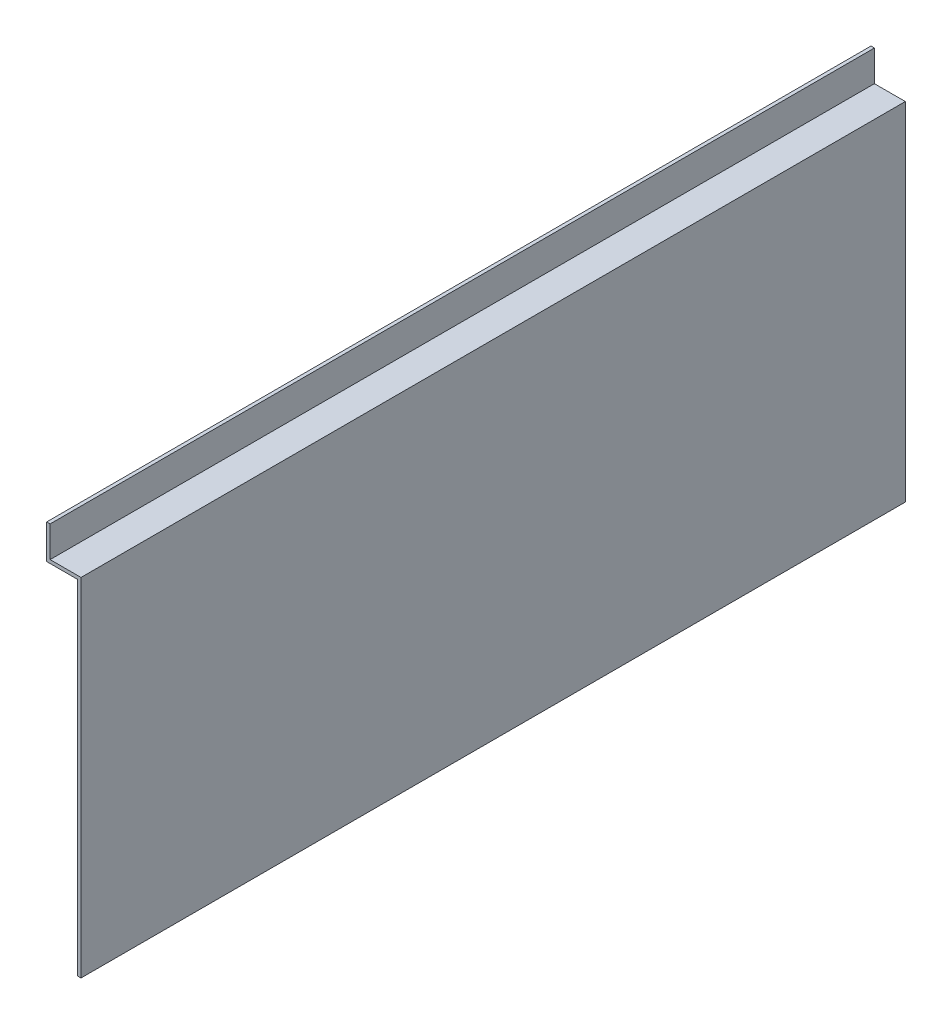
ISO-10303-21;
HEADER;
FILE_DESCRIPTION(('STEP AP214'),'2;1');
FILE_NAME('part.step','',(''),(''),'','','');
FILE_SCHEMA(('AUTOMOTIVE_DESIGN { 1 0 10303 214 1 1 1 1 }'));
ENDSEC;
DATA;
#1=APPLICATION_CONTEXT('core data for automotive mechanical design processes');
#2=APPLICATION_PROTOCOL_DEFINITION('international standard','automotive_design',2000,#1);
#3=PRODUCT_CONTEXT('',#1,'mechanical');
#4=PRODUCT('Part','Part','',(#3));
#5=PRODUCT_RELATED_PRODUCT_CATEGORY('part','',(#4));
#6=PRODUCT_DEFINITION_FORMATION('','',#4);
#7=PRODUCT_DEFINITION_CONTEXT('part definition',#1,'design');
#8=PRODUCT_DEFINITION('design','',#6,#7);
#9=PRODUCT_DEFINITION_SHAPE('','',#8);
#10=(LENGTH_UNIT() NAMED_UNIT(*) SI_UNIT(.MILLI.,.METRE.));
#11=(NAMED_UNIT(*) PLANE_ANGLE_UNIT() SI_UNIT($,.RADIAN.));
#12=(NAMED_UNIT(*) SI_UNIT($,.STERADIAN.) SOLID_ANGLE_UNIT());
#13=UNCERTAINTY_MEASURE_WITH_UNIT(LENGTH_MEASURE(1.E-05),#10,'distance_accuracy_value','');
#14=(GEOMETRIC_REPRESENTATION_CONTEXT(3) GLOBAL_UNCERTAINTY_ASSIGNED_CONTEXT((#13)) GLOBAL_UNIT_ASSIGNED_CONTEXT((#10,
#11,#12)) REPRESENTATION_CONTEXT('',''));
#15=CARTESIAN_POINT('',(0.,0.,0.));
#16=DIRECTION('',(0.,0.,1.));
#17=DIRECTION('',(1.,0.,0.));
#18=AXIS2_PLACEMENT_3D('',#15,#16,#17);
#19=CARTESIAN_POINT('',(9.,-10.,240.));
#20=DIRECTION('',(1.,0.,0.));
#21=DIRECTION('',(0.,1.,0.));
#22=AXIS2_PLACEMENT_3D('',#19,#20,#21);
#23=PLANE('',#22);
#24=DIRECTION('',(0.,-1.,0.));
#25=VECTOR('',#24,1.);
#26=CARTESIAN_POINT('',(9.,-10.,0.));
#27=LINE('',#26,#25);
#28=CARTESIAN_POINT('',(9.,-10.,0.));
#29=VERTEX_POINT('',#28);
#30=CARTESIAN_POINT('',(9.00000000000001,-110.,0.));
#31=VERTEX_POINT('',#30);
#32=EDGE_CURVE('E130',#29,#31,#27,.T.);
#33=ORIENTED_EDGE('',*,*,#32,.T.);
#34=DIRECTION('',(0.,0.,-1.));
#35=VECTOR('',#34,1.);
#36=CARTESIAN_POINT('',(9.00000000000001,-110.,240.));
#37=LINE('',#36,#35);
#38=CARTESIAN_POINT('',(9.00000000000001,-110.,240.));
#39=VERTEX_POINT('',#38);
#40=EDGE_CURVE('E11',#39,#31,#37,.T.);
#41=ORIENTED_EDGE('',*,*,#40,.F.);
#42=DIRECTION('',(0.,-1.,0.));
#43=VECTOR('',#42,1.);
#44=CARTESIAN_POINT('',(9.,-10.,240.));
#45=LINE('',#44,#43);
#46=CARTESIAN_POINT('',(9.,-10.,240.));
#47=VERTEX_POINT('',#46);
#48=EDGE_CURVE('E88',#47,#39,#45,.T.);
#49=ORIENTED_EDGE('',*,*,#48,.F.);
#50=DIRECTION('',(0.,0.,-1.));
#51=VECTOR('',#50,1.);
#52=CARTESIAN_POINT('',(9.,-10.,240.));
#53=LINE('',#52,#51);
#54=EDGE_CURVE('E129',#47,#29,#53,.T.);
#55=ORIENTED_EDGE('',*,*,#54,.T.);
#56=EDGE_LOOP('',(#33,#41,#49,#55));
#57=FACE_BOUND('',#56,.T.);
#58=ADVANCED_FACE('F33',(#57),#23,.F.);
#59=CARTESIAN_POINT('',(10.,-110.,240.));
#60=DIRECTION('',(0.,-1.,0.));
#61=DIRECTION('',(0.,0.,-1.));
#62=AXIS2_PLACEMENT_3D('',#59,#60,#61);
#63=PLANE('',#62);
#64=DIRECTION('',(-1.,0.,0.));
#65=VECTOR('',#64,1.);
#66=CARTESIAN_POINT('',(10.,-110.,0.));
#67=LINE('',#66,#65);
#68=CARTESIAN_POINT('',(10.,-110.,0.));
#69=VERTEX_POINT('',#68);
#70=EDGE_CURVE('E133',#69,#31,#67,.T.);
#71=ORIENTED_EDGE('',*,*,#70,.F.);
#72=DIRECTION('',(0.,0.,-1.));
#73=VECTOR('',#72,1.);
#74=CARTESIAN_POINT('',(10.,-110.,240.));
#75=LINE('',#74,#73);
#76=CARTESIAN_POINT('',(10.,-110.,240.));
#77=VERTEX_POINT('',#76);
#78=EDGE_CURVE('E41',#77,#69,#75,.T.);
#79=ORIENTED_EDGE('',*,*,#78,.F.);
#80=DIRECTION('',(-1.,0.,0.));
#81=VECTOR('',#80,1.);
#82=CARTESIAN_POINT('',(10.,-110.,240.));
#83=LINE('',#82,#81);
#84=EDGE_CURVE('E172',#77,#39,#83,.T.);
#85=ORIENTED_EDGE('',*,*,#84,.T.);
#86=ORIENTED_EDGE('',*,*,#40,.T.);
#87=EDGE_LOOP('',(#71,#79,#85,#86));
#88=FACE_BOUND('',#87,.T.);
#89=ADVANCED_FACE('F163',(#88),#63,.T.);
#90=CARTESIAN_POINT('',(10.,-10.,240.));
#91=DIRECTION('',(1.,0.,0.));
#92=DIRECTION('',(0.,1.,0.));
#93=AXIS2_PLACEMENT_3D('',#90,#91,#92);
#94=PLANE('',#93);
#95=DIRECTION('',(0.,-1.,0.));
#96=VECTOR('',#95,1.);
#97=CARTESIAN_POINT('',(10.,-10.,0.));
#98=LINE('',#97,#96);
#99=CARTESIAN_POINT('',(10.,-9.,0.));
#100=VERTEX_POINT('',#99);
#101=EDGE_CURVE('E136',#100,#69,#98,.T.);
#102=ORIENTED_EDGE('',*,*,#101,.F.);
#103=DIRECTION('',(0.,0.,-1.));
#104=VECTOR('',#103,1.);
#105=CARTESIAN_POINT('',(10.,-9.,240.));
#106=LINE('',#105,#104);
#107=CARTESIAN_POINT('',(10.,-9.,240.));
#108=VERTEX_POINT('',#107);
#109=EDGE_CURVE('E153',#108,#100,#106,.T.);
#110=ORIENTED_EDGE('',*,*,#109,.F.);
#111=DIRECTION('',(0.,-1.,0.));
#112=VECTOR('',#111,1.);
#113=CARTESIAN_POINT('',(10.,-10.,240.));
#114=LINE('',#113,#112);
#115=EDGE_CURVE('E160',#108,#77,#114,.T.);
#116=ORIENTED_EDGE('',*,*,#115,.T.);
#117=ORIENTED_EDGE('',*,*,#78,.T.);
#118=EDGE_LOOP('',(#102,#110,#116,#117));
#119=FACE_BOUND('',#118,.T.);
#120=ADVANCED_FACE('F158',(#119),#94,.T.);
#121=CARTESIAN_POINT('',(0.,-9.,240.));
#122=DIRECTION('',(0.,1.,0.));
#123=DIRECTION('',(0.,0.,1.));
#124=AXIS2_PLACEMENT_3D('',#121,#122,#123);
#125=PLANE('',#124);
#126=DIRECTION('',(1.,0.,0.));
#127=VECTOR('',#126,1.);
#128=CARTESIAN_POINT('',(0.,-9.,0.));
#129=LINE('',#128,#127);
#130=CARTESIAN_POINT('',(1.,-9.,0.));
#131=VERTEX_POINT('',#130);
#132=EDGE_CURVE('E139',#131,#100,#129,.T.);
#133=ORIENTED_EDGE('',*,*,#132,.F.);
#134=DIRECTION('',(0.,0.,-1.));
#135=VECTOR('',#134,1.);
#136=CARTESIAN_POINT('',(1.,-9.,240.));
#137=LINE('',#136,#135);
#138=CARTESIAN_POINT('',(1.,-9.,240.));
#139=VERTEX_POINT('',#138);
#140=EDGE_CURVE('E151',#139,#131,#137,.T.);
#141=ORIENTED_EDGE('',*,*,#140,.F.);
#142=DIRECTION('',(1.,0.,0.));
#143=VECTOR('',#142,1.);
#144=CARTESIAN_POINT('',(0.,-9.,240.));
#145=LINE('',#144,#143);
#146=EDGE_CURVE('E124',#139,#108,#145,.T.);
#147=ORIENTED_EDGE('',*,*,#146,.T.);
#148=ORIENTED_EDGE('',*,*,#109,.T.);
#149=EDGE_LOOP('',(#133,#141,#147,#148));
#150=FACE_BOUND('',#149,.T.);
#151=ADVANCED_FACE('F170',(#150),#125,.T.);
#152=CARTESIAN_POINT('',(1.,0.,240.));
#153=DIRECTION('',(1.,0.,0.));
#154=DIRECTION('',(0.,0.,-1.));
#155=AXIS2_PLACEMENT_3D('',#152,#153,#154);
#156=PLANE('',#155);
#157=DIRECTION('',(0.,1.,0.));
#158=VECTOR('',#157,1.);
#159=CARTESIAN_POINT('',(1.,0.,0.));
#160=LINE('',#159,#158);
#161=CARTESIAN_POINT('',(1.,0.,0.));
#162=VERTEX_POINT('',#161);
#163=EDGE_CURVE('E142',#162,#131,#160,.F.);
#164=ORIENTED_EDGE('',*,*,#163,.F.);
#165=DIRECTION('',(0.,0.,-1.));
#166=VECTOR('',#165,1.);
#167=CARTESIAN_POINT('',(1.,0.,240.));
#168=LINE('',#167,#166);
#169=CARTESIAN_POINT('',(1.,0.,240.));
#170=VERTEX_POINT('',#169);
#171=EDGE_CURVE('E112',#170,#162,#168,.T.);
#172=ORIENTED_EDGE('',*,*,#171,.F.);
#173=DIRECTION('',(0.,1.,0.));
#174=VECTOR('',#173,1.);
#175=CARTESIAN_POINT('',(1.,0.,240.));
#176=LINE('',#175,#174);
#177=EDGE_CURVE('E122',#170,#139,#176,.F.);
#178=ORIENTED_EDGE('',*,*,#177,.T.);
#179=ORIENTED_EDGE('',*,*,#140,.T.);
#180=EDGE_LOOP('',(#164,#172,#178,#179));
#181=FACE_BOUND('',#180,.T.);
#182=ADVANCED_FACE('F177',(#181),#156,.T.);
#183=CARTESIAN_POINT('',(0.,0.,240.));
#184=DIRECTION('',(0.,1.,0.));
#185=DIRECTION('',(0.,0.,1.));
#186=AXIS2_PLACEMENT_3D('',#183,#184,#185);
#187=PLANE('',#186);
#188=DIRECTION('',(1.,0.,0.));
#189=VECTOR('',#188,1.);
#190=CARTESIAN_POINT('',(0.,0.,0.));
#191=LINE('',#190,#189);
#192=CARTESIAN_POINT('',(0.,0.,0.));
#193=VERTEX_POINT('',#192);
#194=EDGE_CURVE('E111',#193,#162,#191,.T.);
#195=ORIENTED_EDGE('',*,*,#194,.F.);
#196=DIRECTION('',(0.,0.,-1.));
#197=VECTOR('',#196,1.);
#198=CARTESIAN_POINT('',(0.,0.,240.));
#199=LINE('',#198,#197);
#200=CARTESIAN_POINT('',(0.,0.,240.));
#201=VERTEX_POINT('',#200);
#202=EDGE_CURVE('E105',#201,#193,#199,.T.);
#203=ORIENTED_EDGE('',*,*,#202,.F.);
#204=DIRECTION('',(1.,0.,0.));
#205=VECTOR('',#204,1.);
#206=CARTESIAN_POINT('',(0.,0.,240.));
#207=LINE('',#206,#205);
#208=EDGE_CURVE('E109',#201,#170,#207,.T.);
#209=ORIENTED_EDGE('',*,*,#208,.T.);
#210=ORIENTED_EDGE('',*,*,#171,.T.);
#211=EDGE_LOOP('',(#195,#203,#209,#210));
#212=FACE_BOUND('',#211,.T.);
#213=ADVANCED_FACE('F107',(#212),#187,.T.);
#214=CARTESIAN_POINT('',(0.,0.,240.));
#215=DIRECTION('',(1.,0.,0.));
#216=DIRECTION('',(0.,0.,-1.));
#217=AXIS2_PLACEMENT_3D('',#214,#215,#216);
#218=PLANE('',#217);
#219=DIRECTION('',(0.,-1.,0.));
#220=VECTOR('',#219,1.);
#221=CARTESIAN_POINT('',(0.,0.,0.));
#222=LINE('',#221,#220);
#223=CARTESIAN_POINT('',(0.,-10.,0.));
#224=VERTEX_POINT('',#223);
#225=EDGE_CURVE('E76',#193,#224,#222,.T.);
#226=ORIENTED_EDGE('',*,*,#225,.T.);
#227=DIRECTION('',(0.,0.,-1.));
#228=VECTOR('',#227,1.);
#229=CARTESIAN_POINT('',(0.,-10.,240.));
#230=LINE('',#229,#228);
#231=CARTESIAN_POINT('',(0.,-10.,240.));
#232=VERTEX_POINT('',#231);
#233=EDGE_CURVE('E113',#232,#224,#230,.T.);
#234=ORIENTED_EDGE('',*,*,#233,.F.);
#235=DIRECTION('',(0.,-1.,0.));
#236=VECTOR('',#235,1.);
#237=CARTESIAN_POINT('',(0.,0.,240.));
#238=LINE('',#237,#236);
#239=EDGE_CURVE('E115',#201,#232,#238,.T.);
#240=ORIENTED_EDGE('',*,*,#239,.F.);
#241=ORIENTED_EDGE('',*,*,#202,.T.);
#242=EDGE_LOOP('',(#226,#234,#240,#241));
#243=FACE_BOUND('',#242,.T.);
#244=ADVANCED_FACE('F116',(#243),#218,.F.);
#245=CARTESIAN_POINT('',(0.,-10.,240.));
#246=DIRECTION('',(0.,1.,0.));
#247=DIRECTION('',(0.,0.,1.));
#248=AXIS2_PLACEMENT_3D('',#245,#246,#247);
#249=PLANE('',#248);
#250=DIRECTION('',(1.,0.,0.));
#251=VECTOR('',#250,1.);
#252=CARTESIAN_POINT('',(0.,-10.,0.));
#253=LINE('',#252,#251);
#254=EDGE_CURVE('E82',#224,#29,#253,.T.);
#255=ORIENTED_EDGE('',*,*,#254,.T.);
#256=ORIENTED_EDGE('',*,*,#54,.F.);
#257=DIRECTION('',(1.,0.,0.));
#258=VECTOR('',#257,1.);
#259=CARTESIAN_POINT('',(0.,-10.,240.));
#260=LINE('',#259,#258);
#261=EDGE_CURVE('E49',#232,#47,#260,.T.);
#262=ORIENTED_EDGE('',*,*,#261,.F.);
#263=ORIENTED_EDGE('',*,*,#233,.T.);
#264=EDGE_LOOP('',(#255,#256,#262,#263));
#265=FACE_BOUND('',#264,.T.);
#266=ADVANCED_FACE('F179',(#265),#249,.F.);
#267=CARTESIAN_POINT('',(0.,0.,240.));
#268=DIRECTION('',(0.,0.,-1.));
#269=DIRECTION('',(-1.,0.,0.));
#270=AXIS2_PLACEMENT_3D('',#267,#268,#269);
#271=PLANE('',#270);
#272=ORIENTED_EDGE('',*,*,#48,.T.);
#273=ORIENTED_EDGE('',*,*,#84,.F.);
#274=ORIENTED_EDGE('',*,*,#115,.F.);
#275=ORIENTED_EDGE('',*,*,#146,.F.);
#276=ORIENTED_EDGE('',*,*,#177,.F.);
#277=ORIENTED_EDGE('',*,*,#208,.F.);
#278=ORIENTED_EDGE('',*,*,#239,.T.);
#279=ORIENTED_EDGE('',*,*,#261,.T.);
#280=EDGE_LOOP('',(#272,#273,#274,#275,#276,#277,#278,#279));
#281=FACE_BOUND('',#280,.T.);
#282=ADVANCED_FACE('F119',(#281),#271,.F.);
#283=CARTESIAN_POINT('',(0.,0.,0.));
#284=DIRECTION('',(0.,0.,-1.));
#285=DIRECTION('',(-1.,0.,0.));
#286=AXIS2_PLACEMENT_3D('',#283,#284,#285);
#287=PLANE('',#286);
#288=ORIENTED_EDGE('',*,*,#32,.F.);
#289=ORIENTED_EDGE('',*,*,#254,.F.);
#290=ORIENTED_EDGE('',*,*,#225,.F.);
#291=ORIENTED_EDGE('',*,*,#194,.T.);
#292=ORIENTED_EDGE('',*,*,#163,.T.);
#293=ORIENTED_EDGE('',*,*,#132,.T.);
#294=ORIENTED_EDGE('',*,*,#101,.T.);
#295=ORIENTED_EDGE('',*,*,#70,.T.);
#296=EDGE_LOOP('',(#288,#289,#290,#291,#292,#293,#294,#295));
#297=FACE_BOUND('',#296,.T.);
#298=ADVANCED_FACE('F166',(#297),#287,.T.);
#299=CLOSED_SHELL('',(#58,#89,#120,#151,#182,#213,#244,#266,#282,#298));
#300=MANIFOLD_SOLID_BREP('B2',#299);
#301=ADVANCED_BREP_SHAPE_REPRESENTATION('',(#18,#300),#14);
#302=SHAPE_DEFINITION_REPRESENTATION(#9,#301);
ENDSEC;
END-ISO-10303-21;
